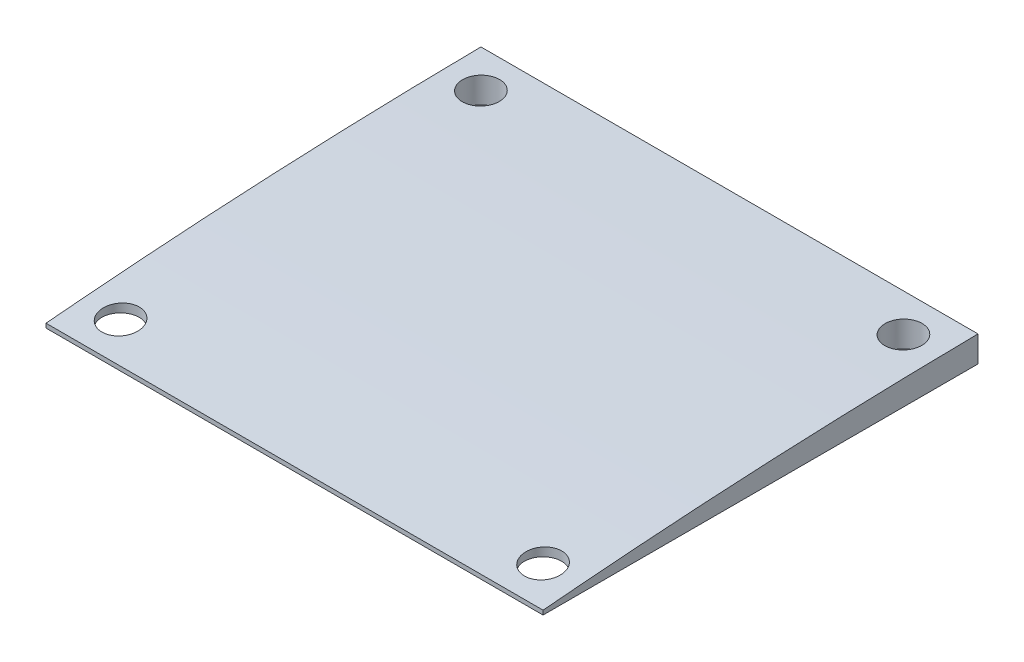
ISO-10303-21;
HEADER;
FILE_DESCRIPTION(('STEP AP214'),'2;1');
FILE_NAME('part.step','',(''),(''),'','','');
FILE_SCHEMA(('AUTOMOTIVE_DESIGN { 1 0 10303 214 1 1 1 1 }'));
ENDSEC;
DATA;
#1=APPLICATION_CONTEXT('core data for automotive mechanical design processes');
#2=APPLICATION_PROTOCOL_DEFINITION('international standard','automotive_design',2000,#1);
#3=PRODUCT_CONTEXT('',#1,'mechanical');
#4=PRODUCT('Part','Part','',(#3));
#5=PRODUCT_RELATED_PRODUCT_CATEGORY('part','',(#4));
#6=PRODUCT_DEFINITION_FORMATION('','',#4);
#7=PRODUCT_DEFINITION_CONTEXT('part definition',#1,'design');
#8=PRODUCT_DEFINITION('design','',#6,#7);
#9=PRODUCT_DEFINITION_SHAPE('','',#8);
#10=(LENGTH_UNIT() NAMED_UNIT(*) SI_UNIT(.MILLI.,.METRE.));
#11=(NAMED_UNIT(*) PLANE_ANGLE_UNIT() SI_UNIT($,.RADIAN.));
#12=(NAMED_UNIT(*) SI_UNIT($,.STERADIAN.) SOLID_ANGLE_UNIT());
#13=UNCERTAINTY_MEASURE_WITH_UNIT(LENGTH_MEASURE(1.E-05),#10,'distance_accuracy_value','');
#14=(GEOMETRIC_REPRESENTATION_CONTEXT(3) GLOBAL_UNCERTAINTY_ASSIGNED_CONTEXT((#13)) GLOBAL_UNIT_ASSIGNED_CONTEXT((#10,
#11,#12)) REPRESENTATION_CONTEXT('',''));
#15=CARTESIAN_POINT('',(0.,0.,0.));
#16=DIRECTION('',(0.,0.,1.));
#17=DIRECTION('',(1.,0.,0.));
#18=AXIS2_PLACEMENT_3D('',#15,#16,#17);
#19=CARTESIAN_POINT('',(-20.,1.0477276566058,-17.5));
#20=CARTESIAN_POINT('',(-20.,0.856176588438773,0.0659947763336803));
#21=CARTESIAN_POINT('',(-20.,-0.704509614142109,17.5));
#22=B_SPLINE_CURVE_WITH_KNOTS('',2,(#19,#20,#21),.UNSPECIFIED.,.F.,.F.,(3,3),(0.,
0.426003169965489),.UNSPECIFIED.);
#23=DIRECTION('',(1.,0.,0.));
#24=VECTOR('',#23,1.);
#25=SURFACE_OF_LINEAR_EXTRUSION('',#22,#24);
#26=CARTESIAN_POINT('',(-17.,-0.324649817653739,12.9999999999999));
#27=CARTESIAN_POINT('',(-16.9159314746889,-0.324650252906181,13.0000058032635));
#28=CARTESIAN_POINT('',(-16.8317751238975,-0.32521284041976,13.0071012800031));
#29=CARTESIAN_POINT('',(-16.7074168916318,-0.326887802804745,13.0282067015718));
#30=CARTESIAN_POINT('',(-16.666243584338,-0.32758555914995,13.0369971558009));
#31=CARTESIAN_POINT('',(-16.5847454518351,-0.329254397128932,13.0580101462615));
#32=CARTESIAN_POINT('',(-16.5444214012039,-0.330225717575126,13.0702356811826));
#33=CARTESIAN_POINT('',(-16.4253275178985,-0.33353847768113,13.1119045672848));
#34=CARTESIAN_POINT('',(-16.348267117291,-0.336280999721608,13.1463690517771));
#35=CARTESIAN_POINT('',(-16.2010413050165,-0.342766296763247,13.2277036936291));
#36=CARTESIAN_POINT('',(-16.1308761501172,-0.346509108994272,13.2745743127328));
#37=CARTESIAN_POINT('',(-16.0322620847633,-0.352799433366544,13.3531517649426));
#38=CARTESIAN_POINT('',(-16.0004582436416,-0.35501230856471,13.3807653528248));
#39=CARTESIAN_POINT('',(-15.9393189060821,-0.359647169016674,13.4385279250244));
#40=CARTESIAN_POINT('',(-15.9099810626813,-0.362068950894892,13.4686744427483));
#41=CARTESIAN_POINT('',(-15.8259206857098,-0.369630263151442,13.5626681317821));
#42=CARTESIAN_POINT('',(-15.7751279844677,-0.375067249051503,13.630088064066));
#43=CARTESIAN_POINT('',(-15.6854547512516,-0.386597709929583,13.7726141939318));
#44=CARTESIAN_POINT('',(-15.6466099845072,-0.392693083554851,13.8477425880601));
#45=CARTESIAN_POINT('',(-15.5820755494286,-0.405367050177395,14.0034249045381));
#46=CARTESIAN_POINT('',(-15.5563860852813,-0.411945650673153,14.0839789110783));
#47=CARTESIAN_POINT('',(-15.5188267655469,-0.425426655985471,14.2484731853518));
#48=CARTESIAN_POINT('',(-15.5069984094239,-0.432329969128686,14.3324228472778));
#49=CARTESIAN_POINT('',(-15.4976238501699,-0.4462502310112,14.5011073588439));
#50=CARTESIAN_POINT('',(-15.5000777969215,-0.453267180942266,14.5858422167145));
#51=CARTESIAN_POINT('',(-15.519215363642,-0.467227475084031,14.7538440476915));
#52=CARTESIAN_POINT('',(-15.535923284421,-0.474170673080567,14.8371082660011));
#53=CARTESIAN_POINT('',(-15.5831345714206,-0.487769283433898,14.9996547601971));
#54=CARTESIAN_POINT('',(-15.6136379720208,-0.494424695073462,15.0789370261597));
#55=CARTESIAN_POINT('',(-15.6875721743526,-0.507247118678819,15.2312283554767));
#56=CARTESIAN_POINT('',(-15.7309975936814,-0.51341433264196,15.3042400144398));
#57=CARTESIAN_POINT('',(-15.8295622240793,-0.525075983964523,15.4419362645432));
#58=CARTESIAN_POINT('',(-15.8847012994303,-0.530570429117699,15.5066209521485));
#59=CARTESIAN_POINT('',(-16.0049863017511,-0.540703325172495,15.6256505182813));
#60=CARTESIAN_POINT('',(-16.0701069623491,-0.545343874033596,15.6800207491344));
#61=CARTESIAN_POINT('',(-16.2086124491782,-0.553639573197801,15.7770492815651));
#62=CARTESIAN_POINT('',(-16.2819971172208,-0.557294742358358,15.8197078072729));
#63=CARTESIAN_POINT('',(-16.4346712951819,-0.563491705083658,15.8919448480864));
#64=CARTESIAN_POINT('',(-16.5139391751918,-0.566037361532003,15.921568748088));
#65=CARTESIAN_POINT('',(-16.6763498717649,-0.569951885469583,15.9670932557702));
#66=CARTESIAN_POINT('',(-16.7594926175055,-0.571320774458206,15.982994114169));
#67=CARTESIAN_POINT('',(-16.9270353569706,-0.572835131088163,16.0005834945954));
#68=CARTESIAN_POINT('',(-17.0114310236351,-0.572984122422261,16.0023129509427));
#69=CARTESIAN_POINT('',(-17.1793132974092,-0.572063130768104,15.9916170088244));
#70=CARTESIAN_POINT('',(-17.2627999120103,-0.570993157832893,15.9791917270957));
#71=CARTESIAN_POINT('',(-17.4264207840576,-0.56767032609746,15.9405642279776));
#72=CARTESIAN_POINT('',(-17.5065578807276,-0.565418491996364,15.9143739451137));
#73=CARTESIAN_POINT('',(-17.6612915167234,-0.559804790737603,15.8489804991939));
#74=CARTESIAN_POINT('',(-17.7358880266871,-0.556442917697842,15.8097772671824));
#75=CARTESIAN_POINT('',(-17.8775548175013,-0.548709575287661,15.7194127624704));
#76=CARTESIAN_POINT('',(-17.9446130374644,-0.544336521306943,15.6682327195125));
#77=CARTESIAN_POINT('',(-18.069189177618,-0.534720595549695,15.5554130792918));
#78=CARTESIAN_POINT('',(-18.1267069395221,-0.529477709344619,15.4937733085255));
#79=CARTESIAN_POINT('',(-18.2307702436423,-0.518264919835212,15.3615707038254));
#80=CARTESIAN_POINT('',(-18.277279599546,-0.51229271404655,15.2909795818031));
#81=CARTESIAN_POINT('',(-18.3577913250844,-0.499815596678265,15.1430361859561));
#82=CARTESIAN_POINT('',(-18.3917934688171,-0.49331067547947,15.0656837900423));
#83=CARTESIAN_POINT('',(-18.4464405347371,-0.479938202352675,14.906132971863));
#84=CARTESIAN_POINT('',(-18.467040199473,-0.473069505580277,14.8239191423548));
#85=CARTESIAN_POINT('',(-18.4941275123001,-0.459189913159797,14.6572105519851));
#86=CARTESIAN_POINT('',(-18.5006149453062,-0.452179015346067,14.5727157563792));
#87=CARTESIAN_POINT('',(-18.4992920751293,-0.438201092919322,14.4036645646344));
#88=CARTESIAN_POINT('',(-18.4914538000204,-0.43123418084964,14.3191083709149));
#89=CARTESIAN_POINT('',(-18.4616490478756,-0.417554679953911,14.1525133840916));
#90=CARTESIAN_POINT('',(-18.4396825156384,-0.410842092121658,14.0704746008251));
#91=CARTESIAN_POINT('',(-18.3822061617319,-0.397853846028297,13.9112207801484));
#92=CARTESIAN_POINT('',(-18.3466992482483,-0.391578094286125,13.8340047110635));
#93=CARTESIAN_POINT('',(-18.2841083247938,-0.382627968295453,13.7235570729102));
#94=CARTESIAN_POINT('',(-18.2616847232024,-0.379721362617842,13.6876312989598));
#95=CARTESIAN_POINT('',(-18.213853971774,-0.374076192548734,13.617757190841));
#96=CARTESIAN_POINT('',(-18.18844393873,-0.371337794498475,13.5838108157387));
#97=CARTESIAN_POINT('',(-18.108172581183,-0.363423003789068,13.4855636942769));
#98=CARTESIAN_POINT('',(-18.0491200609166,-0.358525648526909,13.4245910225183));
#99=CARTESIAN_POINT('',(-17.9215464914773,-0.349617631032784,13.3134467012058));
#100=CARTESIAN_POINT('',(-17.8530258871275,-0.345606927167773,13.2632745445126));
#101=CARTESIAN_POINT('',(-17.7447604710614,-0.340338762978625,13.1972644525399));
#102=CARTESIAN_POINT('',(-17.7077813296293,-0.338708098316884,13.1768117845107));
#103=CARTESIAN_POINT('',(-17.6322604781753,-0.335704233574792,13.139107748675));
#104=CARTESIAN_POINT('',(-17.5937201735819,-0.334330807917572,13.1218535761958));
#105=CARTESIAN_POINT('',(-17.47616305642,-0.33061093079402,13.0750939975214));
#106=CARTESIAN_POINT('',(-17.3950875462656,-0.328658937563468,13.0505169778272));
#107=CARTESIAN_POINT('',(-17.2612533565456,-0.326394291030052,13.0219897699405));
#108=CARTESIAN_POINT('',(-17.2093576709077,-0.325740964029431,13.0137554054382));
#109=CARTESIAN_POINT('',(-17.104986077603,-0.324868591769754,13.0027587126154));
#110=CARTESIAN_POINT('',(-17.0525101708992,-0.324649545790042,12.9999963752146));
#111=CARTESIAN_POINT('',(-17.,-0.324649817653739,12.9999999999999));
#112=B_SPLINE_CURVE_WITH_KNOTS('',3,(#26,#27,#28,#29,#30,#31,#32,#33,#34,#35,#36,#37,#38,#39,
#40,#41,#42,#43,#44,#45,#46,#47,#48,#49,#50,#51,#52,#53,#54,#55,#56,#57,#58,#59,#60,#61,#62,#63,
#64,#65,#66,#67,#68,#69,#70,#71,#72,#73,#74,#75,#76,#77,#78,#79,#80,#81,#82,#83,#84,#85,#86,#87,
#88,#89,#90,#91,#92,#93,#94,#95,#96,#97,#98,#99,#100,#101,#102,#103,#104,#105,#106,#107,#108,
#109,#110,#111),.UNSPECIFIED.,.T.,.F.,(4,2,2,2,2,2,2,2,2,2,2,2,2,2,2,2,2,2,2,2,2,2,2,2,2,2,2,2,
2,2,2,2,2,2,2,2,2,2,2,2,2,2,4),(0.,0.251980515431654,0.37817972370749,0.504489443022928,
0.756601614689604,1.0087231710421,1.13512269867098,1.26140053291124,1.51386768697197,
1.76708338790417,2.02030301894663,2.27427885551754,2.52825735738922,2.78266972038702,
3.03708271740375,3.29138989186891,3.54569412001023,3.79936494651424,4.05303091811302,
4.30580652977486,4.55857752316068,4.81061812521115,5.06265664864704,5.31447700936056,
5.56629870449185,5.81851773358165,6.07074094683222,6.32378208632298,6.57682779595242,
6.8307236146798,7.08462330301602,7.33901927761042,7.59341624617566,7.84775860643222,
7.97497551429109,8.10231626667322,8.35609668297539,8.6098651803919,8.73660007384509,
8.86322330577777,9.11604452626022,9.27343472474893,9.43082466206076),.UNSPECIFIED.);
#113=CARTESIAN_POINT('',(-17.,-0.324649817653739,12.9999999999999));
#114=VERTEX_POINT('',#113);
#115=EDGE_CURVE('E147',#114,#114,#112,.T.);
#116=ORIENTED_EDGE('',*,*,#115,.T.);
#117=EDGE_LOOP('',(#116));
#118=FACE_BOUND('',#117,.T.);
#119=CARTESIAN_POINT('',(17.,1.02887137430243,-16.));
#120=CARTESIAN_POINT('',(17.084259974395,1.02887131673475,-15.9999942155426));
#121=CARTESIAN_POINT('',(17.1686078631159,1.0287700052517,-15.992866737923));
#122=CARTESIAN_POINT('',(17.2932515064727,1.02846707505337,-15.9716630936366));
#123=CARTESIAN_POINT('',(17.3345196229397,1.02834077115524,-15.9628315047594));
#124=CARTESIAN_POINT('',(17.4162064159015,1.0280379351837,-15.9417184455138));
#125=CARTESIAN_POINT('',(17.4566243102696,1.02786135886298,-15.929433936177));
#126=CARTESIAN_POINT('',(17.576001247937,1.02725730009109,-15.887558260967));
#127=CARTESIAN_POINT('',(17.6532472935811,1.02675509316393,-15.8529169116646));
#128=CARTESIAN_POINT('',(17.8008187436118,1.02555662928795,-15.7711432933371));
#129=CARTESIAN_POINT('',(17.8711440100307,1.02486036847166,-15.7240107753664));
#130=CARTESIAN_POINT('',(17.9699183086734,1.02367783436558,-15.6450082693913));
#131=CARTESIAN_POINT('',(18.0017437330128,1.02326029740045,-15.6172681833478));
#132=CARTESIAN_POINT('',(18.0629170473791,1.02238095497269,-15.5592372411086));
#133=CARTESIAN_POINT('',(18.0922672892175,1.02191919244314,-15.5289488621368));
#134=CARTESIAN_POINT('',(18.1763456391736,1.02046901638952,-15.4345066898406));
#135=CARTESIAN_POINT('',(18.2271259250218,1.01941542203057,-15.3667561829436));
#136=CARTESIAN_POINT('',(18.3165675888907,1.01715482355882,-15.223722772865));
#137=CARTESIAN_POINT('',(18.3552280020627,1.01594780724304,-15.1484392706196));
#138=CARTESIAN_POINT('',(18.4193687016757,1.01340433008188,-14.9924433401757));
#139=CARTESIAN_POINT('',(18.4448490054273,1.01206786940652,-14.9117309191076));
#140=CARTESIAN_POINT('',(18.4818987972009,1.00929649770682,-14.7471676317466));
#141=CARTESIAN_POINT('',(18.4934665129438,1.00786157416421,-14.6633163670091));
#142=CARTESIAN_POINT('',(18.5023604936021,1.00493085105176,-14.4948624775016));
#143=CARTESIAN_POINT('',(18.4996867740645,1.00343505154838,-14.4102598535519));
#144=CARTESIAN_POINT('',(18.4801723318302,1.00042562912347,-14.2426958998039));
#145=CARTESIAN_POINT('',(18.4633301037471,0.998912004324873,-14.1597347453684));
#146=CARTESIAN_POINT('',(18.4159548408358,0.995914737824783,-13.9978175067577));
#147=CARTESIAN_POINT('',(18.3854217869483,0.99443109616503,-13.9188614281583));
#148=CARTESIAN_POINT('',(18.3115301655225,0.991543982619355,-13.7671940653773));
#149=CARTESIAN_POINT('',(18.2681713030104,0.99014051257814,-13.6944829248693));
#150=CARTESIAN_POINT('',(18.1698584879845,0.98746423083165,-13.557372133136));
#151=CARTESIAN_POINT('',(18.114904544482,0.986191419024833,-13.4929724754514));
#152=CARTESIAN_POINT('',(17.9949668493118,0.983824625693264,-13.3743196913659));
#153=CARTESIAN_POINT('',(17.9299840794531,0.982730626684536,-13.3200655728787));
#154=CARTESIAN_POINT('',(17.7918290756728,0.980764251156398,-13.2232375677519));
#155=CARTESIAN_POINT('',(17.7186568490385,0.979891874439779,-13.1806636707188));
#156=CARTESIAN_POINT('',(17.5662148018948,0.978404163084922,-13.108413084171));
#157=CARTESIAN_POINT('',(17.4869461340099,0.977788779998927,-13.0787339637246));
#158=CARTESIAN_POINT('',(17.3245496274177,0.976840227867452,-13.0331049207582));
#159=CARTESIAN_POINT('',(17.2414217932058,0.97650705849325,-13.0171549822466));
#160=CARTESIAN_POINT('',(17.0736825154396,0.976136901243439,-12.9994393673441));
#161=CARTESIAN_POINT('',(16.9890713378629,0.976099860802622,-12.9976711735821));
#162=CARTESIAN_POINT('',(16.8207531605543,0.976323379207282,-13.0083626812188));
#163=CARTESIAN_POINT('',(16.7370461603943,0.976583937911807,-13.0208223758786));
#164=CARTESIAN_POINT('',(16.5729173125613,0.977391715573277,-13.0596143705906));
#165=CARTESIAN_POINT('',(16.492495280516,0.977938918418122,-13.0859458909159));
#166=CARTESIAN_POINT('',(16.3372136781866,0.97929730130496,-13.1517328246097));
#167=CARTESIAN_POINT('',(16.2623541094346,0.980108481419665,-13.1911882415931));
#168=CARTESIAN_POINT('',(16.1203139767637,0.981961937556363,-13.2821068922477));
#169=CARTESIAN_POINT('',(16.0531341931039,0.9830042370283,-13.3335713444132));
#170=CARTESIAN_POINT('',(15.9283678884624,0.985278659613889,-13.4470444722423));
#171=CARTESIAN_POINT('',(15.8707813813075,0.98651078300113,-13.5090531631031));
#172=CARTESIAN_POINT('',(15.7668244727234,0.989118128604202,-13.6418676337931));
#173=CARTESIAN_POINT('',(15.7204562501828,0.990493378544946,-13.7126751185457));
#174=CARTESIAN_POINT('',(15.6402653315473,0.993336704814912,-13.8610677409442));
#175=CARTESIAN_POINT('',(15.6064426348948,0.994804781140008,-13.9386528782888));
#176=CARTESIAN_POINT('',(15.552297448531,0.99778354016106,-14.0984130187658));
#177=CARTESIAN_POINT('',(15.531977238223,0.999294230005909,-14.1805887943232));
#178=CARTESIAN_POINT('',(15.5054221223303,1.00230948170689,-14.3471851463009));
#179=CARTESIAN_POINT('',(15.4991872486839,1.00381404354912,-14.4316057278108));
#180=CARTESIAN_POINT('',(15.5009824582095,1.00677270770349,-14.6003037128465));
#181=CARTESIAN_POINT('',(15.509013379685,1.00822680704517,-14.684581107667));
#182=CARTESIAN_POINT('',(15.539105948437,1.01104526334548,-14.8505828849648));
#183=CARTESIAN_POINT('',(15.5611676213268,1.01240962014027,-14.9323072627811));
#184=CARTESIAN_POINT('',(15.6187269331136,1.01501658084428,-15.0909254950168));
#185=CARTESIAN_POINT('',(15.6542240909766,1.01625918911048,-15.1678195222635));
#186=CARTESIAN_POINT('',(15.7167102693186,1.0180104559916,-15.2777866307117));
#187=CARTESIAN_POINT('',(15.7390840453455,1.0185755311342,-15.3135527751085));
#188=CARTESIAN_POINT('',(15.7867837559622,1.01966666810043,-15.3831115594526));
#189=CARTESIAN_POINT('',(15.8121125110243,1.02019269185374,-15.4169022669455));
#190=CARTESIAN_POINT('',(15.8922038336305,1.02170681884438,-15.5148323574018));
#191=CARTESIAN_POINT('',(15.9511331363425,1.02263269382049,-15.5756380001522));
#192=CARTESIAN_POINT('',(16.078375140309,1.02430172334768,-15.6864765787777));
#193=CARTESIAN_POINT('',(16.1466876500093,1.02504488162798,-15.7365097345149));
#194=CARTESIAN_POINT('',(16.2546931664895,1.02601549502084,-15.8024228059175));
#195=CARTESIAN_POINT('',(16.2916539461113,1.02631521900016,-15.8228854957885));
#196=CARTESIAN_POINT('',(16.3671304236425,1.02686557241163,-15.8606086130573));
#197=CARTESIAN_POINT('',(16.4056447208828,1.02711624492635,-15.8778718498673));
#198=CARTESIAN_POINT('',(16.5231147287483,1.027793533327,-15.924661859251));
#199=CARTESIAN_POINT('',(16.6041180192632,1.02814649246127,-15.949262299156));
#200=CARTESIAN_POINT('',(16.7380171817311,1.0285561118508,-15.977886514893));
#201=CARTESIAN_POINT('',(16.7900579312083,1.0286742534757,-15.9861673835373));
#202=CARTESIAN_POINT('',(16.8947210091616,1.02883190268756,-15.9972259334033));
#203=CARTESIAN_POINT('',(16.9473433376101,1.02887141027825,-16.0000036148862));
#204=CARTESIAN_POINT('',(17.,1.02887137430243,-16.));
#205=B_SPLINE_CURVE_WITH_KNOTS('',3,(#119,#120,#121,#122,#123,#124,#125,#126,#127,#128,#129,
#130,#131,#132,#133,#134,#135,#136,#137,#138,#139,#140,#141,#142,#143,#144,#145,#146,#147,#148,
#149,#150,#151,#152,#153,#154,#155,#156,#157,#158,#159,#160,#161,#162,#163,#164,#165,#166,#167,
#168,#169,#170,#171,#172,#173,#174,#175,#176,#177,#178,#179,#180,#181,#182,#183,#184,#185,#186,
#187,#188,#189,#190,#191,#192,#193,#194,#195,#196,#197,#198,#199,#200,#201,#202,#203,#204),
.UNSPECIFIED.,.T.,.F.,(4,2,2,2,2,2,2,2,2,2,2,2,2,2,2,2,2,2,2,2,2,2,2,2,2,2,2,2,2,2,2,2,2,2,2,2,
2,2,2,2,2,2,4),(0.,0.252554546632657,0.379040682984592,0.505638492186753,0.758342148000442,
1.01105084051024,1.13757951362494,1.26398657737099,1.516707503117,1.76944854257071,
2.02218925007717,2.27496214998765,2.52773477395165,2.78053425808582,3.03333409415033,
3.28613974467062,3.53894519872054,3.79172591912768,4.04450641459928,4.29723923502849,
4.54997176107515,4.80265942412006,5.05534696748396,5.30802030895177,5.56069372001723,
5.81339277969492,6.06609220358415,6.31884066907742,6.57158912333841,6.82438023414327,
7.0771719181464,7.3299784574862,7.58278545832876,7.83558340871539,7.96202900691089,
8.08859629799649,8.34136178101663,8.59412210470202,8.72073281975188,8.84723182675625,
9.09981188756959,9.25764103745831,9.41547017985402),.UNSPECIFIED.);
#206=CARTESIAN_POINT('',(17.,1.02887137430243,-16.));
#207=VERTEX_POINT('',#206);
#208=EDGE_CURVE('E135',#207,#207,#205,.T.);
#209=ORIENTED_EDGE('',*,*,#208,.T.);
#210=EDGE_LOOP('',(#209));
#211=FACE_BOUND('',#210,.T.);
#212=DIRECTION('',(1.,0.,0.));
#213=VECTOR('',#212,1.);
#214=CARTESIAN_POINT('',(-20.,-0.704509614142109,17.5));
#215=LINE('',#214,#213);
#216=CARTESIAN_POINT('',(-20.,-0.704509614142109,17.5));
#217=VERTEX_POINT('',#216);
#218=CARTESIAN_POINT('',(20.,-0.704509614142109,17.5));
#219=VERTEX_POINT('',#218);
#220=EDGE_CURVE('E88',#217,#219,#215,.T.);
#221=ORIENTED_EDGE('',*,*,#220,.T.);
#222=CARTESIAN_POINT('',(20.,1.0477276566058,-17.5));
#223=CARTESIAN_POINT('',(20.,0.856176588438773,0.0659947763336803));
#224=CARTESIAN_POINT('',(20.,-0.704509614142109,17.5));
#225=B_SPLINE_CURVE_WITH_KNOTS('',2,(#222,#223,#224),.UNSPECIFIED.,.F.,.F.,(3,3),(0.,
0.426003169965489),.UNSPECIFIED.);
#226=CARTESIAN_POINT('',(20.,1.0477276566058,-17.5));
#227=VERTEX_POINT('',#226);
#228=EDGE_CURVE('E92',#227,#219,#225,.T.);
#229=ORIENTED_EDGE('',*,*,#228,.F.);
#230=DIRECTION('',(1.,0.,0.));
#231=VECTOR('',#230,1.);
#232=CARTESIAN_POINT('',(-20.,1.0477276566058,-17.5));
#233=LINE('',#232,#231);
#234=CARTESIAN_POINT('',(-20.,1.0477276566058,-17.5));
#235=VERTEX_POINT('',#234);
#236=EDGE_CURVE('E80',#235,#227,#233,.T.);
#237=ORIENTED_EDGE('',*,*,#236,.F.);
#238=EDGE_CURVE('E116',#235,#217,#22,.T.);
#239=ORIENTED_EDGE('',*,*,#238,.T.);
#240=EDGE_LOOP('',(#221,#229,#237,#239));
#241=FACE_BOUND('',#240,.T.);
#242=CARTESIAN_POINT('',(-17.,1.02887137430243,-16.));
#243=CARTESIAN_POINT('',(-16.9157400256049,1.02887131673475,-15.9999942155426));
#244=CARTESIAN_POINT('',(-16.831392136884,1.0287700052517,-15.992866737923));
#245=CARTESIAN_POINT('',(-16.7067484935272,1.02846707505337,-15.9716630936366));
#246=CARTESIAN_POINT('',(-16.6654803770602,1.02834077115524,-15.9628315047594));
#247=CARTESIAN_POINT('',(-16.5837935840984,1.0280379351837,-15.9417184455138));
#248=CARTESIAN_POINT('',(-16.5433756897303,1.02786135886298,-15.929433936177));
#249=CARTESIAN_POINT('',(-16.423998752063,1.02725730009109,-15.887558260967));
#250=CARTESIAN_POINT('',(-16.3467527064188,1.02675509316393,-15.8529169116646));
#251=CARTESIAN_POINT('',(-16.1991812563881,1.02555662928795,-15.7711432933371));
#252=CARTESIAN_POINT('',(-16.1288559899692,1.02486036847166,-15.7240107753664));
#253=CARTESIAN_POINT('',(-16.0300816913266,1.02367783436558,-15.6450082693913));
#254=CARTESIAN_POINT('',(-15.9982562669871,1.02326029740045,-15.6172681833478));
#255=CARTESIAN_POINT('',(-15.9370829526208,1.02238095497269,-15.5592372411087));
#256=CARTESIAN_POINT('',(-15.9077327107825,1.02191919244314,-15.5289488621368));
#257=CARTESIAN_POINT('',(-15.8236543608264,1.02046901638952,-15.4345066898406));
#258=CARTESIAN_POINT('',(-15.7728740749782,1.01941542203057,-15.3667561829436));
#259=CARTESIAN_POINT('',(-15.6834324111093,1.01715482355882,-15.223722772865));
#260=CARTESIAN_POINT('',(-15.6447719979373,1.01594780724304,-15.1484392706196));
#261=CARTESIAN_POINT('',(-15.5806312983242,1.01340433008188,-14.9924433401757));
#262=CARTESIAN_POINT('',(-15.5551509945727,1.01206786940652,-14.9117309191077));
#263=CARTESIAN_POINT('',(-15.518101202799,1.00929649770682,-14.7471676317466));
#264=CARTESIAN_POINT('',(-15.5065334870561,1.00786157416421,-14.6633163670091));
#265=CARTESIAN_POINT('',(-15.4976395063978,1.00493085105177,-14.4948624775016));
#266=CARTESIAN_POINT('',(-15.5003132259354,1.00343505154838,-14.4102598535519));
#267=CARTESIAN_POINT('',(-15.5198276681697,1.00042562912347,-14.2426958998039));
#268=CARTESIAN_POINT('',(-15.5366698962528,0.998912004324873,-14.1597347453684));
#269=CARTESIAN_POINT('',(-15.5840451591641,0.995914737824784,-13.9978175067577));
#270=CARTESIAN_POINT('',(-15.6145782130516,0.994431096165031,-13.9188614281583));
#271=CARTESIAN_POINT('',(-15.6884698344774,0.991543982619355,-13.7671940653773));
#272=CARTESIAN_POINT('',(-15.7318286969895,0.99014051257814,-13.6944829248694));
#273=CARTESIAN_POINT('',(-15.8301415120154,0.98746423083165,-13.557372133136));
#274=CARTESIAN_POINT('',(-15.8850954555179,0.986191419024834,-13.4929724754514));
#275=CARTESIAN_POINT('',(-16.0050331506881,0.983824625693264,-13.3743196913659));
#276=CARTESIAN_POINT('',(-16.0700159205468,0.982730626684536,-13.3200655728787));
#277=CARTESIAN_POINT('',(-16.2081709243271,0.980764251156398,-13.2232375677519));
#278=CARTESIAN_POINT('',(-16.2813431509614,0.979891874439779,-13.1806636707188));
#279=CARTESIAN_POINT('',(-16.433785198105,0.978404163084922,-13.108413084171));
#280=CARTESIAN_POINT('',(-16.51305386599,0.977788779998927,-13.0787339637246));
#281=CARTESIAN_POINT('',(-16.6754503725821,0.976840227867452,-13.0331049207582));
#282=CARTESIAN_POINT('',(-16.7585782067941,0.97650705849325,-13.0171549822466));
#283=CARTESIAN_POINT('',(-16.9263174845603,0.976136901243439,-12.9994393673441));
#284=CARTESIAN_POINT('',(-17.010928662137,0.976099860802622,-12.9976711735821));
#285=CARTESIAN_POINT('',(-17.1792468394456,0.976323379207282,-13.0083626812188));
#286=CARTESIAN_POINT('',(-17.2629538396056,0.976583937911806,-13.0208223758786));
#287=CARTESIAN_POINT('',(-17.4270826874386,0.977391715573276,-13.0596143705906));
#288=CARTESIAN_POINT('',(-17.5075047194839,0.977938918418121,-13.0859458909159));
#289=CARTESIAN_POINT('',(-17.6627863218133,0.97929730130496,-13.1517328246097));
#290=CARTESIAN_POINT('',(-17.7376458905653,0.980108481419665,-13.1911882415931));
#291=CARTESIAN_POINT('',(-17.8796860232362,0.981961937556363,-13.2821068922477));
#292=CARTESIAN_POINT('',(-17.946865806896,0.9830042370283,-13.3335713444131));
#293=CARTESIAN_POINT('',(-18.0716321115375,0.985278659613889,-13.4470444722423));
#294=CARTESIAN_POINT('',(-18.1292186186924,0.98651078300113,-13.5090531631031));
#295=CARTESIAN_POINT('',(-18.2331755272765,0.989118128604202,-13.641867633793));
#296=CARTESIAN_POINT('',(-18.2795437498171,0.990493378544946,-13.7126751185457));
#297=CARTESIAN_POINT('',(-18.3597346684526,0.993336704814912,-13.8610677409442));
#298=CARTESIAN_POINT('',(-18.3935573651051,0.994804781140008,-13.9386528782888));
#299=CARTESIAN_POINT('',(-18.4477025514689,0.99778354016106,-14.0984130187657));
#300=CARTESIAN_POINT('',(-18.4680227617769,0.999294230005909,-14.1805887943232));
#301=CARTESIAN_POINT('',(-18.4945778776696,1.00230948170689,-14.3471851463009));
#302=CARTESIAN_POINT('',(-18.500812751316,1.00381404354912,-14.4316057278107));
#303=CARTESIAN_POINT('',(-18.4990175417904,1.00677270770349,-14.6003037128465));
#304=CARTESIAN_POINT('',(-18.4909866203149,1.00822680704517,-14.684581107667));
#305=CARTESIAN_POINT('',(-18.4608940515629,1.01104526334548,-14.8505828849647));
#306=CARTESIAN_POINT('',(-18.4388323786732,1.01240962014027,-14.9323072627811));
#307=CARTESIAN_POINT('',(-18.3812730668863,1.01501658084428,-15.0909254950168));
#308=CARTESIAN_POINT('',(-18.3457759090233,1.01625918911048,-15.1678195222634));
#309=CARTESIAN_POINT('',(-18.2832897306814,1.0180104559916,-15.2777866307116));
#310=CARTESIAN_POINT('',(-18.2609159546544,1.0185755311342,-15.3135527751085));
#311=CARTESIAN_POINT('',(-18.2132162440377,1.01966666810043,-15.3831115594526));
#312=CARTESIAN_POINT('',(-18.1878874889756,1.02019269185374,-15.4169022669455));
#313=CARTESIAN_POINT('',(-18.1077961663694,1.02170681884437,-15.5148323574018));
#314=CARTESIAN_POINT('',(-18.0488668636574,1.02263269382049,-15.5756380001522));
#315=CARTESIAN_POINT('',(-17.9216248596909,1.02430172334768,-15.6864765787777));
#316=CARTESIAN_POINT('',(-17.8533123499907,1.02504488162798,-15.7365097345149));
#317=CARTESIAN_POINT('',(-17.7453068335104,1.02601549502084,-15.8024228059175));
#318=CARTESIAN_POINT('',(-17.7083460538886,1.02631521900016,-15.8228854957885));
#319=CARTESIAN_POINT('',(-17.6328695763574,1.02686557241163,-15.8606086130573));
#320=CARTESIAN_POINT('',(-17.5943552791172,1.02711624492635,-15.8778718498673));
#321=CARTESIAN_POINT('',(-17.4768852712517,1.027793533327,-15.924661859251));
#322=CARTESIAN_POINT('',(-17.3958819807367,1.02814649246127,-15.949262299156));
#323=CARTESIAN_POINT('',(-17.2619828182688,1.0285561118508,-15.977886514893));
#324=CARTESIAN_POINT('',(-17.2099420687916,1.0286742534757,-15.9861673835373));
#325=CARTESIAN_POINT('',(-17.1052789908383,1.02883190268756,-15.9972259334033));
#326=CARTESIAN_POINT('',(-17.0526566623898,1.02887141027825,-16.0000036148862));
#327=CARTESIAN_POINT('',(-17.,1.02887137430243,-16.));
#328=B_SPLINE_CURVE_WITH_KNOTS('',3,(#242,#243,#244,#245,#246,#247,#248,#249,#250,#251,#252,
#253,#254,#255,#256,#257,#258,#259,#260,#261,#262,#263,#264,#265,#266,#267,#268,#269,#270,#271,
#272,#273,#274,#275,#276,#277,#278,#279,#280,#281,#282,#283,#284,#285,#286,#287,#288,#289,#290,
#291,#292,#293,#294,#295,#296,#297,#298,#299,#300,#301,#302,#303,#304,#305,#306,#307,#308,#309,
#310,#311,#312,#313,#314,#315,#316,#317,#318,#319,#320,#321,#322,#323,#324,#325,#326,#327),
.UNSPECIFIED.,.T.,.F.,(4,2,2,2,2,2,2,2,2,2,2,2,2,2,2,2,2,2,2,2,2,2,2,2,2,2,2,2,2,2,2,2,2,2,2,2,
2,2,2,2,2,2,4),(0.,0.252554546632651,0.379040682984585,0.505638492186747,0.758342148000434,
1.01105084051022,1.13757951362493,1.26398657737098,1.51670750311698,1.76944854257069,
2.02218925007716,2.27496214998764,2.52773477395163,2.78053425808581,3.03333409415032,
3.28613974467061,3.53894519872053,3.79172591912767,4.04450641459926,4.29723923502847,
4.54997176107513,4.80265942412004,5.05534696748395,5.30802030895176,5.56069372001722,
5.81339277969491,6.06609220358414,6.31884066907741,6.5715891233384,6.82438023414325,
7.07717191814639,7.32997845748619,7.58278545832874,7.83558340871538,7.96202900691088,
8.08859629799648,8.34136178101662,8.59412210470201,8.72073281975187,8.84723182675623,
9.09981188756957,9.2576410374583,9.41547017985402),.UNSPECIFIED.);
#329=CARTESIAN_POINT('',(-17.,1.02887137430243,-16.));
#330=VERTEX_POINT('',#329);
#331=EDGE_CURVE('E142',#330,#330,#328,.T.);
#332=ORIENTED_EDGE('',*,*,#331,.T.);
#333=EDGE_LOOP('',(#332));
#334=FACE_BOUND('',#333,.T.);
#335=CARTESIAN_POINT('',(17.,-0.324649817653739,12.9999999999999));
#336=CARTESIAN_POINT('',(17.084068525311,-0.324650252906181,13.0000058032635));
#337=CARTESIAN_POINT('',(17.1682248761024,-0.32521284041976,13.0071012800031));
#338=CARTESIAN_POINT('',(17.2925831083681,-0.326887802804745,13.0282067015718));
#339=CARTESIAN_POINT('',(17.3337564156619,-0.32758555914995,13.0369971558009));
#340=CARTESIAN_POINT('',(17.4152545481648,-0.329254397128933,13.0580101462615));
#341=CARTESIAN_POINT('',(17.455578598796,-0.330225717575126,13.0702356811826));
#342=CARTESIAN_POINT('',(17.5746724821014,-0.33353847768113,13.1119045672848));
#343=CARTESIAN_POINT('',(17.651732882709,-0.336280999721608,13.1463690517771));
#344=CARTESIAN_POINT('',(17.7989586949834,-0.342766296763247,13.2277036936291));
#345=CARTESIAN_POINT('',(17.8691238498827,-0.346509108994273,13.2745743127328));
#346=CARTESIAN_POINT('',(17.9677379152366,-0.352799433366544,13.3531517649426));
#347=CARTESIAN_POINT('',(17.9995417563584,-0.35501230856471,13.3807653528248));
#348=CARTESIAN_POINT('',(18.0606810939179,-0.359647169016674,13.4385279250244));
#349=CARTESIAN_POINT('',(18.0900189373186,-0.362068950894893,13.4686744427483));
#350=CARTESIAN_POINT('',(18.1740793142901,-0.369630263151443,13.5626681317821));
#351=CARTESIAN_POINT('',(18.2248720155322,-0.375067249051503,13.630088064066));
#352=CARTESIAN_POINT('',(18.3145452487483,-0.386597709929583,13.7726141939318));
#353=CARTESIAN_POINT('',(18.3533900154927,-0.392693083554851,13.8477425880601));
#354=CARTESIAN_POINT('',(18.4179244505714,-0.405367050177395,14.0034249045381));
#355=CARTESIAN_POINT('',(18.4436139147186,-0.411945650673153,14.0839789110783));
#356=CARTESIAN_POINT('',(18.481173234453,-0.425426655985471,14.2484731853518));
#357=CARTESIAN_POINT('',(18.493001590576,-0.432329969128686,14.3324228472778));
#358=CARTESIAN_POINT('',(18.50237614983,-0.446250231011201,14.5011073588439));
#359=CARTESIAN_POINT('',(18.4999222030784,-0.453267180942267,14.5858422167145));
#360=CARTESIAN_POINT('',(18.4807846363579,-0.467227475084032,14.7538440476915));
#361=CARTESIAN_POINT('',(18.464076715579,-0.474170673080567,14.8371082660011));
#362=CARTESIAN_POINT('',(18.4168654285793,-0.487769283433898,14.9996547601971));
#363=CARTESIAN_POINT('',(18.3863620279791,-0.494424695073462,15.0789370261597));
#364=CARTESIAN_POINT('',(18.3124278256474,-0.507247118678819,15.2312283554767));
#365=CARTESIAN_POINT('',(18.2690024063186,-0.51341433264196,15.3042400144398));
#366=CARTESIAN_POINT('',(18.1704377759206,-0.525075983964524,15.4419362645432));
#367=CARTESIAN_POINT('',(18.1152987005696,-0.530570429117699,15.5066209521485));
#368=CARTESIAN_POINT('',(17.9950136982488,-0.540703325172495,15.6256505182813));
#369=CARTESIAN_POINT('',(17.9298930376508,-0.545343874033596,15.6800207491344));
#370=CARTESIAN_POINT('',(17.7913875508218,-0.553639573197802,15.7770492815651));
#371=CARTESIAN_POINT('',(17.7180028827791,-0.557294742358358,15.8197078072729));
#372=CARTESIAN_POINT('',(17.565328704818,-0.563491705083658,15.8919448480864));
#373=CARTESIAN_POINT('',(17.4860608248081,-0.566037361532003,15.921568748088));
#374=CARTESIAN_POINT('',(17.323650128235,-0.569951885469583,15.9670932557702));
#375=CARTESIAN_POINT('',(17.2405073824944,-0.571320774458207,15.982994114169));
#376=CARTESIAN_POINT('',(17.0729646430293,-0.572835131088164,16.0005834945954));
#377=CARTESIAN_POINT('',(16.9885689763648,-0.572984122422261,16.0023129509427));
#378=CARTESIAN_POINT('',(16.8206867025907,-0.572063130768103,15.9916170088244));
#379=CARTESIAN_POINT('',(16.7372000879897,-0.570993157832893,15.9791917270957));
#380=CARTESIAN_POINT('',(16.5735792159423,-0.56767032609746,15.9405642279776));
#381=CARTESIAN_POINT('',(16.4934421192723,-0.565418491996364,15.9143739451137));
#382=CARTESIAN_POINT('',(16.3387084832765,-0.559804790737603,15.8489804991939));
#383=CARTESIAN_POINT('',(16.2641119733128,-0.556442917697842,15.8097772671824));
#384=CARTESIAN_POINT('',(16.1224451824986,-0.548709575287661,15.7194127624704));
#385=CARTESIAN_POINT('',(16.0553869625355,-0.544336521306942,15.6682327195125));
#386=CARTESIAN_POINT('',(15.9308108223819,-0.534720595549694,15.5554130792918));
#387=CARTESIAN_POINT('',(15.8732930604778,-0.529477709344619,15.4937733085255));
#388=CARTESIAN_POINT('',(15.7692297563576,-0.518264919835212,15.3615707038254));
#389=CARTESIAN_POINT('',(15.7227204004539,-0.51229271404655,15.2909795818031));
#390=CARTESIAN_POINT('',(15.6422086749155,-0.499815596678265,15.1430361859561));
#391=CARTESIAN_POINT('',(15.6082065311828,-0.49331067547947,15.0656837900423));
#392=CARTESIAN_POINT('',(15.5535594652628,-0.479938202352675,14.906132971863));
#393=CARTESIAN_POINT('',(15.5329598005269,-0.473069505580277,14.8239191423548));
#394=CARTESIAN_POINT('',(15.5058724876999,-0.459189913159797,14.6572105519851));
#395=CARTESIAN_POINT('',(15.4993850546937,-0.452179015346066,14.5727157563792));
#396=CARTESIAN_POINT('',(15.5007079248706,-0.438201092919322,14.4036645646344));
#397=CARTESIAN_POINT('',(15.5085461999795,-0.431234180849639,14.3191083709149));
#398=CARTESIAN_POINT('',(15.5383509521243,-0.417554679953911,14.1525133840916));
#399=CARTESIAN_POINT('',(15.5603174843616,-0.410842092121658,14.0704746008251));
#400=CARTESIAN_POINT('',(15.617793838268,-0.397853846028297,13.9112207801484));
#401=CARTESIAN_POINT('',(15.6533007517516,-0.391578094286125,13.8340047110635));
#402=CARTESIAN_POINT('',(15.7158916752061,-0.382627968295453,13.7235570729102));
#403=CARTESIAN_POINT('',(15.7383152767975,-0.379721362617842,13.6876312989598));
#404=CARTESIAN_POINT('',(15.7861460282259,-0.374076192548734,13.617757190841));
#405=CARTESIAN_POINT('',(15.8115560612699,-0.371337794498475,13.5838108157387));
#406=CARTESIAN_POINT('',(15.8918274188169,-0.363423003789068,13.4855636942769));
#407=CARTESIAN_POINT('',(15.9508799390833,-0.358525648526909,13.4245910225183));
#408=CARTESIAN_POINT('',(16.0784535085226,-0.349617631032784,13.3134467012058));
#409=CARTESIAN_POINT('',(16.1469741128724,-0.345606927167773,13.2632745445126));
#410=CARTESIAN_POINT('',(16.2552395289385,-0.340338762978625,13.1972644525399));
#411=CARTESIAN_POINT('',(16.2922186703707,-0.338708098316884,13.1768117845107));
#412=CARTESIAN_POINT('',(16.3677395218247,-0.335704233574792,13.139107748675));
#413=CARTESIAN_POINT('',(16.406279826418,-0.334330807917572,13.1218535761958));
#414=CARTESIAN_POINT('',(16.5238369435799,-0.330610930794019,13.0750939975214));
#415=CARTESIAN_POINT('',(16.6049124537343,-0.328658937563468,13.0505169778272));
#416=CARTESIAN_POINT('',(16.7387466434543,-0.326394291030052,13.0219897699405));
#417=CARTESIAN_POINT('',(16.7906423290922,-0.325740964029431,13.0137554054382));
#418=CARTESIAN_POINT('',(16.8950139223969,-0.324868591769754,13.0027587126154));
#419=CARTESIAN_POINT('',(16.9474898291007,-0.324649545790042,12.9999963752146));
#420=CARTESIAN_POINT('',(17.,-0.324649817653739,12.9999999999999));
#421=B_SPLINE_CURVE_WITH_KNOTS('',3,(#335,#336,#337,#338,#339,#340,#341,#342,#343,#344,#345,
#346,#347,#348,#349,#350,#351,#352,#353,#354,#355,#356,#357,#358,#359,#360,#361,#362,#363,#364,
#365,#366,#367,#368,#369,#370,#371,#372,#373,#374,#375,#376,#377,#378,#379,#380,#381,#382,#383,
#384,#385,#386,#387,#388,#389,#390,#391,#392,#393,#394,#395,#396,#397,#398,#399,#400,#401,#402,
#403,#404,#405,#406,#407,#408,#409,#410,#411,#412,#413,#414,#415,#416,#417,#418,#419,#420),
.UNSPECIFIED.,.T.,.F.,(4,2,2,2,2,2,2,2,2,2,2,2,2,2,2,2,2,2,2,2,2,2,2,2,2,2,2,2,2,2,2,2,2,2,2,2,
2,2,2,2,2,2,4),(0.,0.251980515431654,0.378179723707494,0.504489443022932,0.756601614689608,
1.0087231710421,1.13512269867099,1.26140053291124,1.51386768697197,1.76708338790417,
2.02030301894664,2.27427885551754,2.52825735738922,2.78266972038702,3.03708271740375,
3.29138989186891,3.54569412001023,3.79936494651424,4.05303091811302,4.30580652977486,
4.55857752316068,4.81061812521116,5.06265664864705,5.31447700936056,5.56629870449185,
5.81851773358166,6.07074094683222,6.32378208632298,6.57682779595242,6.8307236146798,
7.08462330301602,7.33901927761042,7.59341624617567,7.84775860643222,7.97497551429109,
8.10231626667322,8.3560966829754,8.60986518039191,8.73660007384511,8.86322330577778,
9.11604452626023,9.27343472474894,9.43082466206076),.UNSPECIFIED.);
#422=CARTESIAN_POINT('',(17.,-0.324649817653739,12.9999999999999));
#423=VERTEX_POINT('',#422);
#424=EDGE_CURVE('E41',#423,#423,#421,.T.);
#425=ORIENTED_EDGE('',*,*,#424,.T.);
#426=EDGE_LOOP('',(#425));
#427=FACE_BOUND('',#426,.T.);
#428=ADVANCED_FACE('F37',(#118,#211,#241,#334,#427),#25,.T.);
#429=CARTESIAN_POINT('',(-20.,-1.04772765660579,-17.5));
#430=DIRECTION('',(0.,0.,-1.));
#431=DIRECTION('',(-1.,0.,0.));
#432=AXIS2_PLACEMENT_3D('',#429,#430,#431);
#433=PLANE('',#432);
#434=ORIENTED_EDGE('',*,*,#236,.T.);
#435=DIRECTION('',(0.,1.,0.));
#436=VECTOR('',#435,1.);
#437=CARTESIAN_POINT('',(20.,-1.04772765660579,-17.5));
#438=LINE('',#437,#436);
#439=CARTESIAN_POINT('',(20.,-1.04772765660579,-17.5));
#440=VERTEX_POINT('',#439);
#441=EDGE_CURVE('E83',#440,#227,#438,.T.);
#442=ORIENTED_EDGE('',*,*,#441,.F.);
#443=DIRECTION('',(1.,0.,0.));
#444=VECTOR('',#443,1.);
#445=CARTESIAN_POINT('',(-20.,-1.04772765660579,-17.5));
#446=LINE('',#445,#444);
#447=CARTESIAN_POINT('',(-20.,-1.04772765660579,-17.5));
#448=VERTEX_POINT('',#447);
#449=EDGE_CURVE('E11',#448,#440,#446,.T.);
#450=ORIENTED_EDGE('',*,*,#449,.F.);
#451=DIRECTION('',(0.,1.,0.));
#452=VECTOR('',#451,1.);
#453=CARTESIAN_POINT('',(-20.,-1.04772765660579,-17.5));
#454=LINE('',#453,#452);
#455=EDGE_CURVE('E84',#448,#235,#454,.T.);
#456=ORIENTED_EDGE('',*,*,#455,.T.);
#457=EDGE_LOOP('',(#434,#442,#450,#456));
#458=FACE_BOUND('',#457,.T.);
#459=ADVANCED_FACE('F39',(#458),#433,.T.);
#460=CARTESIAN_POINT('',(-20.,-1.04772765660579,-17.5));
#461=DIRECTION('',(0.,-1.,0.));
#462=DIRECTION('',(0.,0.,-1.));
#463=AXIS2_PLACEMENT_3D('',#460,#461,#462);
#464=PLANE('',#463);
#465=CARTESIAN_POINT('',(17.,-1.04772765660579,14.5));
#466=DIRECTION('',(0.,-1.,0.));
#467=DIRECTION('',(0.,0.,-1.));
#468=AXIS2_PLACEMENT_3D('',#465,#466,#467);
#469=CIRCLE('',#468,1.50000000000002);
#470=CARTESIAN_POINT('',(17.,-1.04772765660579,12.9999999999999));
#471=VERTEX_POINT('',#470);
#472=EDGE_CURVE('E102',#471,#471,#469,.F.);
#473=ORIENTED_EDGE('',*,*,#472,.T.);
#474=EDGE_LOOP('',(#473));
#475=FACE_BOUND('',#474,.T.);
#476=CARTESIAN_POINT('',(-17.,-1.04772765660579,14.5));
#477=DIRECTION('',(0.,-1.,0.));
#478=DIRECTION('',(0.,0.,-1.));
#479=AXIS2_PLACEMENT_3D('',#476,#477,#478);
#480=CIRCLE('',#479,1.50000000000002);
#481=CARTESIAN_POINT('',(-17.,-1.04772765660579,12.9999999999999));
#482=VERTEX_POINT('',#481);
#483=EDGE_CURVE('E153',#482,#482,#480,.F.);
#484=ORIENTED_EDGE('',*,*,#483,.T.);
#485=EDGE_LOOP('',(#484));
#486=FACE_BOUND('',#485,.T.);
#487=CARTESIAN_POINT('',(-17.,-1.04772765660579,-14.5));
#488=DIRECTION('',(0.,-1.,0.));
#489=DIRECTION('',(0.,0.,-1.));
#490=AXIS2_PLACEMENT_3D('',#487,#488,#489);
#491=CIRCLE('',#490,1.50000000000002);
#492=CARTESIAN_POINT('',(-17.,-1.04772765660579,-16.));
#493=VERTEX_POINT('',#492);
#494=EDGE_CURVE('E154',#493,#493,#491,.F.);
#495=ORIENTED_EDGE('',*,*,#494,.T.);
#496=EDGE_LOOP('',(#495));
#497=FACE_BOUND('',#496,.T.);
#498=CARTESIAN_POINT('',(17.,-1.04772765660579,-14.5));
#499=DIRECTION('',(0.,-1.,0.));
#500=DIRECTION('',(0.,0.,-1.));
#501=AXIS2_PLACEMENT_3D('',#498,#499,#500);
#502=CIRCLE('',#501,1.50000000000002);
#503=CARTESIAN_POINT('',(17.,-1.04772765660579,-16.));
#504=VERTEX_POINT('',#503);
#505=EDGE_CURVE('E193',#504,#504,#502,.F.);
#506=ORIENTED_EDGE('',*,*,#505,.T.);
#507=EDGE_LOOP('',(#506));
#508=FACE_BOUND('',#507,.T.);
#509=ORIENTED_EDGE('',*,*,#449,.T.);
#510=DIRECTION('',(0.,0.,-1.));
#511=VECTOR('',#510,1.);
#512=CARTESIAN_POINT('',(20.,-1.04772765660579,-17.5));
#513=LINE('',#512,#511);
#514=CARTESIAN_POINT('',(20.,-1.04772765660579,17.5));
#515=VERTEX_POINT('',#514);
#516=EDGE_CURVE('E101',#515,#440,#513,.T.);
#517=ORIENTED_EDGE('',*,*,#516,.F.);
#518=DIRECTION('',(1.,0.,0.));
#519=VECTOR('',#518,1.);
#520=CARTESIAN_POINT('',(-20.,-1.04772765660579,17.5));
#521=LINE('',#520,#519);
#522=CARTESIAN_POINT('',(-20.,-1.04772765660579,17.5));
#523=VERTEX_POINT('',#522);
#524=EDGE_CURVE('E50',#523,#515,#521,.T.);
#525=ORIENTED_EDGE('',*,*,#524,.F.);
#526=DIRECTION('',(0.,0.,-1.));
#527=VECTOR('',#526,1.);
#528=CARTESIAN_POINT('',(-20.,-1.04772765660579,-17.5));
#529=LINE('',#528,#527);
#530=EDGE_CURVE('E89',#523,#448,#529,.T.);
#531=ORIENTED_EDGE('',*,*,#530,.T.);
#532=EDGE_LOOP('',(#509,#517,#525,#531));
#533=FACE_BOUND('',#532,.T.);
#534=ADVANCED_FACE('F175',(#475,#486,#497,#508,#533),#464,.T.);
#535=CARTESIAN_POINT('',(-20.,-1.04772765660579,17.5));
#536=DIRECTION('',(0.,0.,1.));
#537=DIRECTION('',(1.,0.,0.));
#538=AXIS2_PLACEMENT_3D('',#535,#536,#537);
#539=PLANE('',#538);
#540=ORIENTED_EDGE('',*,*,#524,.T.);
#541=DIRECTION('',(0.,-1.,0.));
#542=VECTOR('',#541,1.);
#543=CARTESIAN_POINT('',(20.,-1.04772765660579,17.5));
#544=LINE('',#543,#542);
#545=EDGE_CURVE('E97',#219,#515,#544,.T.);
#546=ORIENTED_EDGE('',*,*,#545,.F.);
#547=ORIENTED_EDGE('',*,*,#220,.F.);
#548=DIRECTION('',(0.,-1.,0.));
#549=VECTOR('',#548,1.);
#550=CARTESIAN_POINT('',(-20.,-1.04772765660579,17.5));
#551=LINE('',#550,#549);
#552=EDGE_CURVE('E121',#217,#523,#551,.T.);
#553=ORIENTED_EDGE('',*,*,#552,.T.);
#554=EDGE_LOOP('',(#540,#546,#547,#553));
#555=FACE_BOUND('',#554,.T.);
#556=ADVANCED_FACE('F130',(#555),#539,.T.);
#557=CARTESIAN_POINT('',(-20.,0.513892804835308,0.0329973881668544));
#558=DIRECTION('',(-1.,0.,0.));
#559=DIRECTION('',(0.,0.,1.));
#560=AXIS2_PLACEMENT_3D('',#557,#558,#559);
#561=PLANE('',#560);
#562=ORIENTED_EDGE('',*,*,#455,.F.);
#563=ORIENTED_EDGE('',*,*,#530,.F.);
#564=ORIENTED_EDGE('',*,*,#552,.F.);
#565=ORIENTED_EDGE('',*,*,#238,.F.);
#566=EDGE_LOOP('',(#562,#563,#564,#565));
#567=FACE_BOUND('',#566,.T.);
#568=ADVANCED_FACE('F172',(#567),#561,.T.);
#569=CARTESIAN_POINT('',(20.,0.513892804835308,0.0329973881668544));
#570=DIRECTION('',(-1.,0.,0.));
#571=DIRECTION('',(0.,0.,1.));
#572=AXIS2_PLACEMENT_3D('',#569,#570,#571);
#573=PLANE('',#572);
#574=ORIENTED_EDGE('',*,*,#441,.T.);
#575=ORIENTED_EDGE('',*,*,#228,.T.);
#576=ORIENTED_EDGE('',*,*,#545,.T.);
#577=ORIENTED_EDGE('',*,*,#516,.T.);
#578=EDGE_LOOP('',(#574,#575,#576,#577));
#579=FACE_BOUND('',#578,.T.);
#580=ADVANCED_FACE('F100',(#579),#573,.F.);
#581=CARTESIAN_POINT('',(17.,2.,-14.5));
#582=DIRECTION('',(0.,-1.,0.));
#583=DIRECTION('',(0.,0.,-1.));
#584=AXIS2_PLACEMENT_3D('',#581,#582,#583);
#585=CYLINDRICAL_SURFACE('',#584,1.50000000000002);
#586=ORIENTED_EDGE('',*,*,#505,.F.);
#587=EDGE_LOOP('',(#586));
#588=FACE_BOUND('',#587,.T.);
#589=ORIENTED_EDGE('',*,*,#208,.F.);
#590=EDGE_LOOP('',(#589));
#591=FACE_BOUND('',#590,.T.);
#592=ADVANCED_FACE('F165',(#588,#591),#585,.F.);
#593=CARTESIAN_POINT('',(-17.,2.,-14.5));
#594=DIRECTION('',(0.,-1.,0.));
#595=DIRECTION('',(0.,0.,-1.));
#596=AXIS2_PLACEMENT_3D('',#593,#594,#595);
#597=CYLINDRICAL_SURFACE('',#596,1.50000000000002);
#598=ORIENTED_EDGE('',*,*,#494,.F.);
#599=EDGE_LOOP('',(#598));
#600=FACE_BOUND('',#599,.T.);
#601=ORIENTED_EDGE('',*,*,#331,.F.);
#602=EDGE_LOOP('',(#601));
#603=FACE_BOUND('',#602,.T.);
#604=ADVANCED_FACE('F159',(#600,#603),#597,.F.);
#605=CARTESIAN_POINT('',(-17.,2.,14.5));
#606=DIRECTION('',(0.,-1.,0.));
#607=DIRECTION('',(0.,0.,-1.));
#608=AXIS2_PLACEMENT_3D('',#605,#606,#607);
#609=CYLINDRICAL_SURFACE('',#608,1.50000000000002);
#610=ORIENTED_EDGE('',*,*,#483,.F.);
#611=EDGE_LOOP('',(#610));
#612=FACE_BOUND('',#611,.T.);
#613=ORIENTED_EDGE('',*,*,#115,.F.);
#614=EDGE_LOOP('',(#613));
#615=FACE_BOUND('',#614,.T.);
#616=ADVANCED_FACE('F155',(#612,#615),#609,.F.);
#617=CARTESIAN_POINT('',(17.,2.,14.5));
#618=DIRECTION('',(0.,-1.,0.));
#619=DIRECTION('',(0.,0.,-1.));
#620=AXIS2_PLACEMENT_3D('',#617,#618,#619);
#621=CYLINDRICAL_SURFACE('',#620,1.50000000000002);
#622=ORIENTED_EDGE('',*,*,#472,.F.);
#623=EDGE_LOOP('',(#622));
#624=FACE_BOUND('',#623,.T.);
#625=ORIENTED_EDGE('',*,*,#424,.F.);
#626=EDGE_LOOP('',(#625));
#627=FACE_BOUND('',#626,.T.);
#628=ADVANCED_FACE('F158',(#624,#627),#621,.F.);
#629=CLOSED_SHELL('',(#428,#459,#534,#556,#568,#580,#592,#604,#616,#628));
#630=MANIFOLD_SOLID_BREP('B2',#629);
#631=ADVANCED_BREP_SHAPE_REPRESENTATION('',(#18,#630),#14);
#632=SHAPE_DEFINITION_REPRESENTATION(#9,#631);
ENDSEC;
END-ISO-10303-21;
